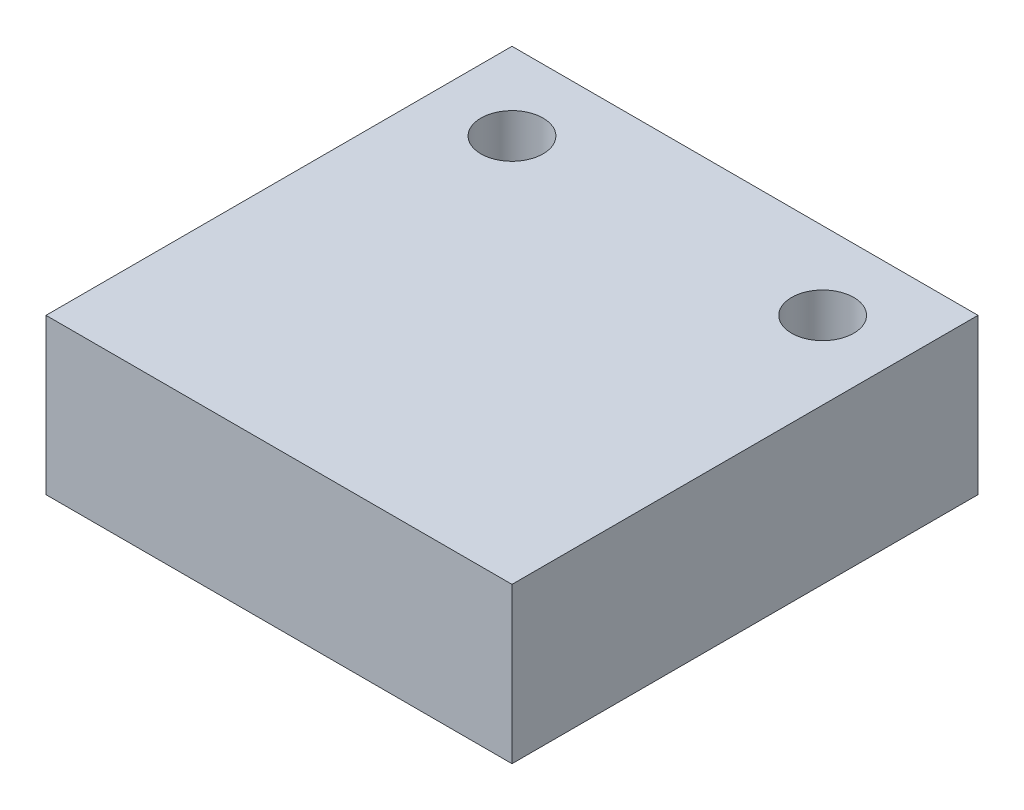
ISO-10303-21;
HEADER;
FILE_DESCRIPTION(('STEP AP214'),'2;1');
FILE_NAME('part.step','',(''),(''),'','','');
FILE_SCHEMA(('AUTOMOTIVE_DESIGN { 1 0 10303 214 1 1 1 1 }'));
ENDSEC;
DATA;
#1=APPLICATION_CONTEXT('core data for automotive mechanical design processes');
#2=APPLICATION_PROTOCOL_DEFINITION('international standard','automotive_design',2000,#1);
#3=PRODUCT_CONTEXT('',#1,'mechanical');
#4=PRODUCT('Part','Part','',(#3));
#5=PRODUCT_RELATED_PRODUCT_CATEGORY('part','',(#4));
#6=PRODUCT_DEFINITION_FORMATION('','',#4);
#7=PRODUCT_DEFINITION_CONTEXT('part definition',#1,'design');
#8=PRODUCT_DEFINITION('design','',#6,#7);
#9=PRODUCT_DEFINITION_SHAPE('','',#8);
#10=(LENGTH_UNIT() NAMED_UNIT(*) SI_UNIT(.MILLI.,.METRE.));
#11=(NAMED_UNIT(*) PLANE_ANGLE_UNIT() SI_UNIT($,.RADIAN.));
#12=(NAMED_UNIT(*) SI_UNIT($,.STERADIAN.) SOLID_ANGLE_UNIT());
#13=UNCERTAINTY_MEASURE_WITH_UNIT(LENGTH_MEASURE(1.E-05),#10,'distance_accuracy_value','');
#14=(GEOMETRIC_REPRESENTATION_CONTEXT(3) GLOBAL_UNCERTAINTY_ASSIGNED_CONTEXT((#13)) GLOBAL_UNIT_ASSIGNED_CONTEXT((#10,
#11,#12)) REPRESENTATION_CONTEXT('',''));
#15=CARTESIAN_POINT('',(0.,0.,0.));
#16=DIRECTION('',(0.,0.,1.));
#17=DIRECTION('',(1.,0.,0.));
#18=AXIS2_PLACEMENT_3D('',#15,#16,#17);
#19=CARTESIAN_POINT('',(75.,50.,-75.));
#20=DIRECTION('',(-1.,0.,0.));
#21=DIRECTION('',(0.,0.,1.));
#22=AXIS2_PLACEMENT_3D('',#19,#20,#21);
#23=PLANE('',#22);
#24=DIRECTION('',(0.,0.,-1.));
#25=VECTOR('',#24,1.);
#26=CARTESIAN_POINT('',(75.,0.,-75.));
#27=LINE('',#26,#25);
#28=CARTESIAN_POINT('',(75.,0.,75.));
#29=VERTEX_POINT('',#28);
#30=CARTESIAN_POINT('',(75.,0.,-75.));
#31=VERTEX_POINT('',#30);
#32=EDGE_CURVE('E99',#29,#31,#27,.T.);
#33=ORIENTED_EDGE('',*,*,#32,.T.);
#34=DIRECTION('',(0.,-1.,0.));
#35=VECTOR('',#34,1.);
#36=CARTESIAN_POINT('',(75.,50.,-75.));
#37=LINE('',#36,#35);
#38=CARTESIAN_POINT('',(75.,50.,-75.));
#39=VERTEX_POINT('',#38);
#40=EDGE_CURVE('E11',#39,#31,#37,.T.);
#41=ORIENTED_EDGE('',*,*,#40,.F.);
#42=DIRECTION('',(0.,0.,-1.));
#43=VECTOR('',#42,1.);
#44=CARTESIAN_POINT('',(75.,50.,-75.));
#45=LINE('',#44,#43);
#46=CARTESIAN_POINT('',(75.,50.,75.));
#47=VERTEX_POINT('',#46);
#48=EDGE_CURVE('E87',#47,#39,#45,.T.);
#49=ORIENTED_EDGE('',*,*,#48,.F.);
#50=DIRECTION('',(0.,-1.,0.));
#51=VECTOR('',#50,1.);
#52=CARTESIAN_POINT('',(75.,50.,75.));
#53=LINE('',#52,#51);
#54=EDGE_CURVE('E95',#47,#29,#53,.T.);
#55=ORIENTED_EDGE('',*,*,#54,.T.);
#56=EDGE_LOOP('',(#33,#41,#49,#55));
#57=FACE_BOUND('',#56,.T.);
#58=ADVANCED_FACE('F36',(#57),#23,.F.);
#59=CARTESIAN_POINT('',(-75.,50.,-75.));
#60=DIRECTION('',(0.,0.,1.));
#61=DIRECTION('',(1.,0.,0.));
#62=AXIS2_PLACEMENT_3D('',#59,#60,#61);
#63=PLANE('',#62);
#64=DIRECTION('',(-1.,0.,0.));
#65=VECTOR('',#64,1.);
#66=CARTESIAN_POINT('',(-75.,0.,-75.));
#67=LINE('',#66,#65);
#68=CARTESIAN_POINT('',(-75.,0.,-75.));
#69=VERTEX_POINT('',#68);
#70=EDGE_CURVE('E91',#31,#69,#67,.T.);
#71=ORIENTED_EDGE('',*,*,#70,.T.);
#72=DIRECTION('',(0.,-1.,0.));
#73=VECTOR('',#72,1.);
#74=CARTESIAN_POINT('',(-75.,50.,-75.));
#75=LINE('',#74,#73);
#76=CARTESIAN_POINT('',(-75.,50.,-75.));
#77=VERTEX_POINT('',#76);
#78=EDGE_CURVE('E44',#77,#69,#75,.T.);
#79=ORIENTED_EDGE('',*,*,#78,.F.);
#80=DIRECTION('',(-1.,0.,0.));
#81=VECTOR('',#80,1.);
#82=CARTESIAN_POINT('',(-75.,50.,-75.));
#83=LINE('',#82,#81);
#84=EDGE_CURVE('E82',#39,#77,#83,.T.);
#85=ORIENTED_EDGE('',*,*,#84,.F.);
#86=ORIENTED_EDGE('',*,*,#40,.T.);
#87=EDGE_LOOP('',(#71,#79,#85,#86));
#88=FACE_BOUND('',#87,.T.);
#89=ADVANCED_FACE('F90',(#88),#63,.F.);
#90=CARTESIAN_POINT('',(-75.,50.,-75.));
#91=DIRECTION('',(1.,0.,0.));
#92=DIRECTION('',(0.,0.,-1.));
#93=AXIS2_PLACEMENT_3D('',#90,#91,#92);
#94=PLANE('',#93);
#95=DIRECTION('',(0.,0.,1.));
#96=VECTOR('',#95,1.);
#97=CARTESIAN_POINT('',(-75.,0.,-75.));
#98=LINE('',#97,#96);
#99=CARTESIAN_POINT('',(-75.,0.,75.));
#100=VERTEX_POINT('',#99);
#101=EDGE_CURVE('E69',#69,#100,#98,.T.);
#102=ORIENTED_EDGE('',*,*,#101,.T.);
#103=DIRECTION('',(0.,-1.,0.));
#104=VECTOR('',#103,1.);
#105=CARTESIAN_POINT('',(-75.,50.,75.));
#106=LINE('',#105,#104);
#107=CARTESIAN_POINT('',(-75.,50.,75.));
#108=VERTEX_POINT('',#107);
#109=EDGE_CURVE('E92',#108,#100,#106,.T.);
#110=ORIENTED_EDGE('',*,*,#109,.F.);
#111=DIRECTION('',(0.,0.,1.));
#112=VECTOR('',#111,1.);
#113=CARTESIAN_POINT('',(-75.,50.,-75.));
#114=LINE('',#113,#112);
#115=EDGE_CURVE('E85',#77,#108,#114,.T.);
#116=ORIENTED_EDGE('',*,*,#115,.F.);
#117=ORIENTED_EDGE('',*,*,#78,.T.);
#118=EDGE_LOOP('',(#102,#110,#116,#117));
#119=FACE_BOUND('',#118,.T.);
#120=ADVANCED_FACE('F93',(#119),#94,.F.);
#121=CARTESIAN_POINT('',(-75.,50.,75.));
#122=DIRECTION('',(0.,0.,-1.));
#123=DIRECTION('',(-1.,0.,0.));
#124=AXIS2_PLACEMENT_3D('',#121,#122,#123);
#125=PLANE('',#124);
#126=DIRECTION('',(1.,0.,0.));
#127=VECTOR('',#126,1.);
#128=CARTESIAN_POINT('',(-75.,0.,75.));
#129=LINE('',#128,#127);
#130=EDGE_CURVE('E75',#100,#29,#129,.T.);
#131=ORIENTED_EDGE('',*,*,#130,.T.);
#132=ORIENTED_EDGE('',*,*,#54,.F.);
#133=DIRECTION('',(1.,0.,0.));
#134=VECTOR('',#133,1.);
#135=CARTESIAN_POINT('',(-75.,50.,75.));
#136=LINE('',#135,#134);
#137=EDGE_CURVE('E52',#108,#47,#136,.T.);
#138=ORIENTED_EDGE('',*,*,#137,.F.);
#139=ORIENTED_EDGE('',*,*,#109,.T.);
#140=EDGE_LOOP('',(#131,#132,#138,#139));
#141=FACE_BOUND('',#140,.T.);
#142=ADVANCED_FACE('F107',(#141),#125,.F.);
#143=CARTESIAN_POINT('',(0.,50.,0.));
#144=DIRECTION('',(0.,1.,0.));
#145=DIRECTION('',(0.,0.,1.));
#146=AXIS2_PLACEMENT_3D('',#143,#144,#145);
#147=PLANE('',#146);
#148=CARTESIAN_POINT('',(-50.,50.,-50.));
#149=DIRECTION('',(0.,1.,0.));
#150=DIRECTION('',(0.,0.,1.));
#151=AXIS2_PLACEMENT_3D('',#148,#149,#150);
#152=CIRCLE('',#151,10.);
#153=CARTESIAN_POINT('',(-50.,50.,-40.));
#154=VERTEX_POINT('',#153);
#155=EDGE_CURVE('E119',#154,#154,#152,.T.);
#156=ORIENTED_EDGE('',*,*,#155,.F.);
#157=EDGE_LOOP('',(#156));
#158=FACE_BOUND('',#157,.T.);
#159=CARTESIAN_POINT('',(50.,50.,-50.));
#160=DIRECTION('',(0.,1.,0.));
#161=DIRECTION('',(0.,0.,-1.));
#162=AXIS2_PLACEMENT_3D('',#159,#160,#161);
#163=CIRCLE('',#162,10.);
#164=CARTESIAN_POINT('',(50.,50.,-60.));
#165=VERTEX_POINT('',#164);
#166=EDGE_CURVE('E113',#165,#165,#163,.T.);
#167=ORIENTED_EDGE('',*,*,#166,.F.);
#168=EDGE_LOOP('',(#167));
#169=FACE_BOUND('',#168,.T.);
#170=ORIENTED_EDGE('',*,*,#48,.T.);
#171=ORIENTED_EDGE('',*,*,#84,.T.);
#172=ORIENTED_EDGE('',*,*,#115,.T.);
#173=ORIENTED_EDGE('',*,*,#137,.T.);
#174=EDGE_LOOP('',(#170,#171,#172,#173));
#175=FACE_BOUND('',#174,.T.);
#176=ADVANCED_FACE('F83',(#158,#169,#175),#147,.T.);
#177=CARTESIAN_POINT('',(0.,0.,0.));
#178=DIRECTION('',(0.,1.,0.));
#179=DIRECTION('',(0.,0.,1.));
#180=AXIS2_PLACEMENT_3D('',#177,#178,#179);
#181=PLANE('',#180);
#182=CARTESIAN_POINT('',(-50.,0.,-50.));
#183=DIRECTION('',(0.,1.,0.));
#184=DIRECTION('',(0.,0.,1.));
#185=AXIS2_PLACEMENT_3D('',#182,#183,#184);
#186=CIRCLE('',#185,10.);
#187=CARTESIAN_POINT('',(-50.,0.,-40.));
#188=VERTEX_POINT('',#187);
#189=EDGE_CURVE('E102',#188,#188,#186,.T.);
#190=ORIENTED_EDGE('',*,*,#189,.T.);
#191=EDGE_LOOP('',(#190));
#192=FACE_BOUND('',#191,.T.);
#193=CARTESIAN_POINT('',(50.,0.,-50.));
#194=DIRECTION('',(0.,1.,0.));
#195=DIRECTION('',(0.,0.,-1.));
#196=AXIS2_PLACEMENT_3D('',#193,#194,#195);
#197=CIRCLE('',#196,10.);
#198=CARTESIAN_POINT('',(50.,0.,-60.));
#199=VERTEX_POINT('',#198);
#200=EDGE_CURVE('E116',#199,#199,#197,.T.);
#201=ORIENTED_EDGE('',*,*,#200,.T.);
#202=EDGE_LOOP('',(#201));
#203=FACE_BOUND('',#202,.T.);
#204=ORIENTED_EDGE('',*,*,#32,.F.);
#205=ORIENTED_EDGE('',*,*,#130,.F.);
#206=ORIENTED_EDGE('',*,*,#101,.F.);
#207=ORIENTED_EDGE('',*,*,#70,.F.);
#208=EDGE_LOOP('',(#204,#205,#206,#207));
#209=FACE_BOUND('',#208,.T.);
#210=ADVANCED_FACE('F110',(#192,#203,#209),#181,.F.);
#211=CARTESIAN_POINT('',(50.,0.,-50.));
#212=DIRECTION('',(0.,1.,0.));
#213=DIRECTION('',(0.,0.,1.));
#214=AXIS2_PLACEMENT_3D('',#211,#212,#213);
#215=CYLINDRICAL_SURFACE('',#214,10.);
#216=ORIENTED_EDGE('',*,*,#200,.F.);
#217=EDGE_LOOP('',(#216));
#218=FACE_BOUND('',#217,.T.);
#219=ORIENTED_EDGE('',*,*,#166,.T.);
#220=EDGE_LOOP('',(#219));
#221=FACE_BOUND('',#220,.T.);
#222=ADVANCED_FACE('F130',(#218,#221),#215,.F.);
#223=CARTESIAN_POINT('',(-50.,0.,-50.));
#224=DIRECTION('',(0.,1.,0.));
#225=DIRECTION('',(0.,0.,1.));
#226=AXIS2_PLACEMENT_3D('',#223,#224,#225);
#227=CYLINDRICAL_SURFACE('',#226,10.);
#228=ORIENTED_EDGE('',*,*,#189,.F.);
#229=EDGE_LOOP('',(#228));
#230=FACE_BOUND('',#229,.T.);
#231=ORIENTED_EDGE('',*,*,#155,.T.);
#232=EDGE_LOOP('',(#231));
#233=FACE_BOUND('',#232,.T.);
#234=ADVANCED_FACE('F127',(#230,#233),#227,.F.);
#235=CLOSED_SHELL('',(#58,#89,#120,#142,#176,#210,#222,#234));
#236=MANIFOLD_SOLID_BREP('B2',#235);
#237=ADVANCED_BREP_SHAPE_REPRESENTATION('',(#18,#236),#14);
#238=SHAPE_DEFINITION_REPRESENTATION(#9,#237);
ENDSEC;
END-ISO-10303-21;
